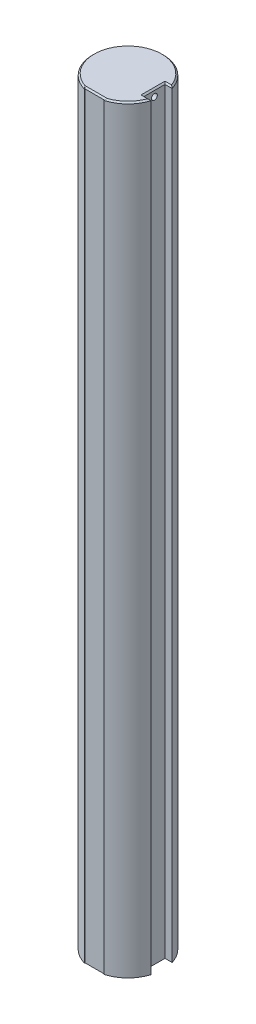
ISO-10303-21;
HEADER;
FILE_DESCRIPTION(('STEP AP214'),'2;1');
FILE_NAME('part.step','',(''),(''),'','','');
FILE_SCHEMA(('AUTOMOTIVE_DESIGN { 1 0 10303 214 1 1 1 1 }'));
ENDSEC;
DATA;
#1=APPLICATION_CONTEXT('core data for automotive mechanical design processes');
#2=APPLICATION_PROTOCOL_DEFINITION('international standard','automotive_design',2000,#1);
#3=PRODUCT_CONTEXT('',#1,'mechanical');
#4=PRODUCT('Part','Part','',(#3));
#5=PRODUCT_RELATED_PRODUCT_CATEGORY('part','',(#4));
#6=PRODUCT_DEFINITION_FORMATION('','',#4);
#7=PRODUCT_DEFINITION_CONTEXT('part definition',#1,'design');
#8=PRODUCT_DEFINITION('design','',#6,#7);
#9=PRODUCT_DEFINITION_SHAPE('','',#8);
#10=(LENGTH_UNIT() NAMED_UNIT(*) SI_UNIT(.MILLI.,.METRE.));
#11=(NAMED_UNIT(*) PLANE_ANGLE_UNIT() SI_UNIT($,.RADIAN.));
#12=(NAMED_UNIT(*) SI_UNIT($,.STERADIAN.) SOLID_ANGLE_UNIT());
#13=UNCERTAINTY_MEASURE_WITH_UNIT(LENGTH_MEASURE(1.E-05),#10,'distance_accuracy_value','');
#14=(GEOMETRIC_REPRESENTATION_CONTEXT(3) GLOBAL_UNCERTAINTY_ASSIGNED_CONTEXT((#13)) GLOBAL_UNIT_ASSIGNED_CONTEXT((#10,
#11,#12)) REPRESENTATION_CONTEXT('',''));
#15=CARTESIAN_POINT('',(0.,0.,0.));
#16=DIRECTION('',(0.,0.,1.));
#17=DIRECTION('',(1.,0.,0.));
#18=AXIS2_PLACEMENT_3D('',#15,#16,#17);
#19=CARTESIAN_POINT('',(0.,430.4,0.));
#20=DIRECTION('',(0.,-1.,0.));
#21=DIRECTION('',(0.,0.,-1.));
#22=AXIS2_PLACEMENT_3D('',#19,#20,#21);
#23=CYLINDRICAL_SURFACE('',#22,20.);
#24=DIRECTION('',(0.,-1.,0.));
#25=VECTOR('',#24,1.);
#26=CARTESIAN_POINT('',(19.0787840283389,430.401,6.00000000000001));
#27=LINE('',#26,#25);
#28=CARTESIAN_POINT('',(19.0787840283389,429.6,6.00000000000001));
#29=VERTEX_POINT('',#28);
#30=CARTESIAN_POINT('',(19.0787840283389,0.,6.00000000000001));
#31=VERTEX_POINT('',#30);
#32=EDGE_CURVE('E149',#29,#31,#27,.T.);
#33=ORIENTED_EDGE('',*,*,#32,.F.);
#34=CARTESIAN_POINT('',(0.,429.6,0.));
#35=DIRECTION('',(0.,1.,0.));
#36=DIRECTION('',(0.,0.,1.));
#37=AXIS2_PLACEMENT_3D('',#34,#35,#36);
#38=CIRCLE('',#37,20.);
#39=CARTESIAN_POINT('',(5.5,429.6,19.2288845230294));
#40=VERTEX_POINT('',#39);
#41=EDGE_CURVE('E11',#29,#40,#38,.F.);
#42=ORIENTED_EDGE('',*,*,#41,.T.);
#43=DIRECTION('',(0.,-1.,0.));
#44=VECTOR('',#43,1.);
#45=CARTESIAN_POINT('',(5.5,430.401,19.2288845230294));
#46=LINE('',#45,#44);
#47=CARTESIAN_POINT('',(5.5,0.,19.2288845230294));
#48=VERTEX_POINT('',#47);
#49=EDGE_CURVE('E314',#40,#48,#46,.T.);
#50=ORIENTED_EDGE('',*,*,#49,.T.);
#51=CARTESIAN_POINT('',(0.,0.,0.));
#52=DIRECTION('',(0.,1.,0.));
#53=DIRECTION('',(0.,0.,1.));
#54=AXIS2_PLACEMENT_3D('',#51,#52,#53);
#55=CIRCLE('',#54,20.);
#56=EDGE_CURVE('E359',#48,#31,#55,.T.);
#57=ORIENTED_EDGE('',*,*,#56,.T.);
#58=EDGE_LOOP('',(#33,#42,#50,#57));
#59=FACE_BOUND('',#58,.T.);
#60=ADVANCED_FACE('F36',(#59),#23,.T.);
#61=DIRECTION('',(0.,-1.,0.));
#62=VECTOR('',#61,1.);
#63=CARTESIAN_POINT('',(-5.5,430.401,19.2288845230294));
#64=LINE('',#63,#62);
#65=CARTESIAN_POINT('',(-5.5,429.6,19.2288845230294));
#66=VERTEX_POINT('',#65);
#67=CARTESIAN_POINT('',(-5.5,0.,19.2288845230294));
#68=VERTEX_POINT('',#67);
#69=EDGE_CURVE('E324',#66,#68,#64,.T.);
#70=ORIENTED_EDGE('',*,*,#69,.F.);
#71=CARTESIAN_POINT('',(0.,429.6,0.));
#72=DIRECTION('',(0.,1.,0.));
#73=DIRECTION('',(0.,0.,1.));
#74=AXIS2_PLACEMENT_3D('',#71,#72,#73);
#75=CIRCLE('',#74,20.);
#76=CARTESIAN_POINT('',(19.0787840283389,429.6,-5.99999999999999));
#77=VERTEX_POINT('',#76);
#78=EDGE_CURVE('E167',#66,#77,#75,.F.);
#79=ORIENTED_EDGE('',*,*,#78,.T.);
#80=DIRECTION('',(0.,-1.,0.));
#81=VECTOR('',#80,1.);
#82=CARTESIAN_POINT('',(19.0787840283389,430.401,-5.99999999999999));
#83=LINE('',#82,#81);
#84=CARTESIAN_POINT('',(19.0787840283389,0.,-5.99999999999999));
#85=VERTEX_POINT('',#84);
#86=EDGE_CURVE('E152',#77,#85,#83,.T.);
#87=ORIENTED_EDGE('',*,*,#86,.T.);
#88=EDGE_CURVE('E358',#85,#68,#55,.T.);
#89=ORIENTED_EDGE('',*,*,#88,.T.);
#90=EDGE_LOOP('',(#70,#79,#87,#89));
#91=FACE_BOUND('',#90,.T.);
#92=ADVANCED_FACE('F230',(#91),#23,.T.);
#93=CARTESIAN_POINT('',(0.,430.4,0.));
#94=DIRECTION('',(0.,1.,0.));
#95=DIRECTION('',(0.,0.,1.));
#96=AXIS2_PLACEMENT_3D('',#93,#94,#95);
#97=PLANE('',#96);
#98=DIRECTION('',(1.,0.,0.));
#99=VECTOR('',#98,1.);
#100=CARTESIAN_POINT('',(0.,430.4,18.1000000000002));
#101=LINE('',#100,#99);
#102=CARTESIAN_POINT('',(-6.29999999999975,430.4,18.1000000000002));
#103=VERTEX_POINT('',#102);
#104=CARTESIAN_POINT('',(6.29999999999975,430.4,18.1000000000002));
#105=VERTEX_POINT('',#104);
#106=EDGE_CURVE('E334',#103,#105,#101,.T.);
#107=ORIENTED_EDGE('',*,*,#106,.T.);
#108=DIRECTION('',(0.,0.,1.));
#109=VECTOR('',#108,1.);
#110=CARTESIAN_POINT('',(6.29999999999975,430.4,0.));
#111=LINE('',#110,#109);
#112=CARTESIAN_POINT('',(6.29999999999975,430.4,18.1369788002306));
#113=VERTEX_POINT('',#112);
#114=EDGE_CURVE('E330',#105,#113,#111,.T.);
#115=ORIENTED_EDGE('',*,*,#114,.T.);
#116=CARTESIAN_POINT('',(0.,430.4,0.));
#117=DIRECTION('',(0.,1.,0.));
#118=DIRECTION('',(0.,0.,1.));
#119=AXIS2_PLACEMENT_3D('',#116,#117,#118);
#120=CIRCLE('',#119,19.2000000000002);
#121=CARTESIAN_POINT('',(17.9555005499711,430.4,6.79999999999974));
#122=VERTEX_POINT('',#121);
#123=EDGE_CURVE('E379',#113,#122,#120,.T.);
#124=ORIENTED_EDGE('',*,*,#123,.T.);
#125=DIRECTION('',(-1.,0.,0.));
#126=VECTOR('',#125,1.);
#127=CARTESIAN_POINT('',(0.,430.4,6.79999999999976));
#128=LINE('',#127,#126);
#129=CARTESIAN_POINT('',(14.2000000000002,430.4,6.79999999999976));
#130=VERTEX_POINT('',#129);
#131=EDGE_CURVE('E308',#122,#130,#128,.T.);
#132=ORIENTED_EDGE('',*,*,#131,.T.);
#133=DIRECTION('',(0.,0.,-1.));
#134=VECTOR('',#133,1.);
#135=CARTESIAN_POINT('',(14.2000000000002,430.4,0.));
#136=LINE('',#135,#134);
#137=CARTESIAN_POINT('',(14.2000000000002,430.4,-6.79999999999975));
#138=VERTEX_POINT('',#137);
#139=EDGE_CURVE('E304',#130,#138,#136,.T.);
#140=ORIENTED_EDGE('',*,*,#139,.T.);
#141=DIRECTION('',(1.,0.,0.));
#142=VECTOR('',#141,1.);
#143=CARTESIAN_POINT('',(0.,430.4,-6.79999999999975));
#144=LINE('',#143,#142);
#145=CARTESIAN_POINT('',(17.9555005499711,430.4,-6.79999999999975));
#146=VERTEX_POINT('',#145);
#147=EDGE_CURVE('E301',#138,#146,#144,.T.);
#148=ORIENTED_EDGE('',*,*,#147,.T.);
#149=CARTESIAN_POINT('',(0.,430.4,0.));
#150=DIRECTION('',(0.,1.,0.));
#151=DIRECTION('',(0.,0.,1.));
#152=AXIS2_PLACEMENT_3D('',#149,#150,#151);
#153=CIRCLE('',#152,19.2000000000002);
#154=CARTESIAN_POINT('',(-6.29999999999975,430.4,18.1369788002306));
#155=VERTEX_POINT('',#154);
#156=EDGE_CURVE('E386',#146,#155,#153,.T.);
#157=ORIENTED_EDGE('',*,*,#156,.T.);
#158=DIRECTION('',(0.,0.,-1.));
#159=VECTOR('',#158,1.);
#160=CARTESIAN_POINT('',(-6.29999999999975,430.4,0.));
#161=LINE('',#160,#159);
#162=EDGE_CURVE('E388',#155,#103,#161,.T.);
#163=ORIENTED_EDGE('',*,*,#162,.T.);
#164=EDGE_LOOP('',(#107,#115,#124,#132,#140,#148,#157,#163));
#165=FACE_BOUND('',#164,.T.);
#166=ADVANCED_FACE('F235',(#165),#97,.T.);
#167=CARTESIAN_POINT('',(0.,0.,0.));
#168=DIRECTION('',(0.,1.,0.));
#169=DIRECTION('',(0.,0.,1.));
#170=AXIS2_PLACEMENT_3D('',#167,#168,#169);
#171=PLANE('',#170);
#172=CARTESIAN_POINT('',(0.,0.,12.5));
#173=DIRECTION('',(0.,-1.,0.));
#174=DIRECTION('',(0.,0.,-1.));
#175=AXIS2_PLACEMENT_3D('',#172,#173,#174);
#176=CIRCLE('',#175,3.39999999999999);
#177=CARTESIAN_POINT('',(0.,0.,9.10000000000001));
#178=VERTEX_POINT('',#177);
#179=EDGE_CURVE('E346',#178,#178,#176,.T.);
#180=ORIENTED_EDGE('',*,*,#179,.F.);
#181=EDGE_LOOP('',(#180));
#182=FACE_BOUND('',#181,.T.);
#183=CARTESIAN_POINT('',(0.,0.,-12.5));
#184=DIRECTION('',(0.,-1.,0.));
#185=DIRECTION('',(0.,0.,-1.));
#186=AXIS2_PLACEMENT_3D('',#183,#184,#185);
#187=CIRCLE('',#186,3.39999999999999);
#188=CARTESIAN_POINT('',(0.,0.,-15.9));
#189=VERTEX_POINT('',#188);
#190=EDGE_CURVE('E352',#189,#189,#187,.T.);
#191=ORIENTED_EDGE('',*,*,#190,.F.);
#192=EDGE_LOOP('',(#191));
#193=FACE_BOUND('',#192,.T.);
#194=DIRECTION('',(-1.,0.,0.));
#195=VECTOR('',#194,1.);
#196=CARTESIAN_POINT('',(0.,0.,6.00000000000001));
#197=LINE('',#196,#195);
#198=CARTESIAN_POINT('',(15.,0.,6.00000000000001));
#199=VERTEX_POINT('',#198);
#200=EDGE_CURVE('E377',#31,#199,#197,.T.);
#201=ORIENTED_EDGE('',*,*,#200,.F.);
#202=ORIENTED_EDGE('',*,*,#56,.F.);
#203=DIRECTION('',(0.,0.,1.));
#204=VECTOR('',#203,1.);
#205=CARTESIAN_POINT('',(5.5,0.,0.));
#206=LINE('',#205,#204);
#207=CARTESIAN_POINT('',(5.5,0.,18.9));
#208=VERTEX_POINT('',#207);
#209=EDGE_CURVE('E321',#208,#48,#206,.T.);
#210=ORIENTED_EDGE('',*,*,#209,.F.);
#211=DIRECTION('',(1.,0.,0.));
#212=VECTOR('',#211,1.);
#213=CARTESIAN_POINT('',(0.,0.,18.9));
#214=LINE('',#213,#212);
#215=CARTESIAN_POINT('',(-5.5,0.,18.9));
#216=VERTEX_POINT('',#215);
#217=EDGE_CURVE('E407',#216,#208,#214,.T.);
#218=ORIENTED_EDGE('',*,*,#217,.F.);
#219=DIRECTION('',(0.,0.,-1.));
#220=VECTOR('',#219,1.);
#221=CARTESIAN_POINT('',(-5.5,0.,0.));
#222=LINE('',#221,#220);
#223=EDGE_CURVE('E373',#68,#216,#222,.T.);
#224=ORIENTED_EDGE('',*,*,#223,.F.);
#225=ORIENTED_EDGE('',*,*,#88,.F.);
#226=DIRECTION('',(1.,0.,0.));
#227=VECTOR('',#226,1.);
#228=CARTESIAN_POINT('',(0.,0.,-5.99999999999999));
#229=LINE('',#228,#227);
#230=CARTESIAN_POINT('',(15.,0.,-5.99999999999999));
#231=VERTEX_POINT('',#230);
#232=EDGE_CURVE('E371',#231,#85,#229,.T.);
#233=ORIENTED_EDGE('',*,*,#232,.F.);
#234=DIRECTION('',(0.,0.,-1.));
#235=VECTOR('',#234,1.);
#236=CARTESIAN_POINT('',(15.,0.,0.));
#237=LINE('',#236,#235);
#238=EDGE_CURVE('E293',#199,#231,#237,.T.);
#239=ORIENTED_EDGE('',*,*,#238,.F.);
#240=EDGE_LOOP('',(#201,#202,#210,#218,#224,#225,#233,#239));
#241=FACE_BOUND('',#240,.T.);
#242=ADVANCED_FACE('F238',(#182,#193,#241),#171,.F.);
#243=CARTESIAN_POINT('',(0.,22.25,-12.5));
#244=DIRECTION('',(0.,-1.,0.));
#245=DIRECTION('',(0.,0.,-1.));
#246=AXIS2_PLACEMENT_3D('',#243,#244,#245);
#247=CONICAL_SURFACE('',#246,3.4,1.02974425867665);
#248=CARTESIAN_POINT('',(0.,24.2929261046937,-12.5));
#249=VERTEX_POINT('',#248);
#250=VERTEX_LOOP('',#249);
#251=FACE_BOUND('',#250,.T.);
#252=CARTESIAN_POINT('',(0.,22.25,-12.5));
#253=DIRECTION('',(0.,-1.,0.));
#254=DIRECTION('',(0.,0.,-1.));
#255=AXIS2_PLACEMENT_3D('',#252,#253,#254);
#256=CIRCLE('',#255,3.4);
#257=CARTESIAN_POINT('',(0.,22.25,-15.9));
#258=VERTEX_POINT('',#257);
#259=EDGE_CURVE('E355',#258,#258,#256,.T.);
#260=ORIENTED_EDGE('',*,*,#259,.T.);
#261=EDGE_LOOP('',(#260));
#262=FACE_BOUND('',#261,.T.);
#263=ADVANCED_FACE('F241',(#251,#262),#247,.F.);
#264=CARTESIAN_POINT('',(0.,0.,-12.5));
#265=DIRECTION('',(0.,-1.,0.));
#266=DIRECTION('',(0.,0.,-1.));
#267=AXIS2_PLACEMENT_3D('',#264,#265,#266);
#268=CYLINDRICAL_SURFACE('',#267,3.39999999999999);
#269=ORIENTED_EDGE('',*,*,#259,.F.);
#270=EDGE_LOOP('',(#269));
#271=FACE_BOUND('',#270,.T.);
#272=ORIENTED_EDGE('',*,*,#190,.T.);
#273=EDGE_LOOP('',(#272));
#274=FACE_BOUND('',#273,.T.);
#275=ADVANCED_FACE('F248',(#271,#274),#268,.F.);
#276=CARTESIAN_POINT('',(0.,22.25,12.5));
#277=DIRECTION('',(0.,-1.,0.));
#278=DIRECTION('',(0.,0.,-1.));
#279=AXIS2_PLACEMENT_3D('',#276,#277,#278);
#280=CONICAL_SURFACE('',#279,3.4,1.02974425867665);
#281=CARTESIAN_POINT('',(0.,24.2929261046937,12.5));
#282=VERTEX_POINT('',#281);
#283=VERTEX_LOOP('',#282);
#284=FACE_BOUND('',#283,.T.);
#285=CARTESIAN_POINT('',(0.,22.25,12.5));
#286=DIRECTION('',(0.,-1.,0.));
#287=DIRECTION('',(0.,0.,-1.));
#288=AXIS2_PLACEMENT_3D('',#285,#286,#287);
#289=CIRCLE('',#288,3.4);
#290=CARTESIAN_POINT('',(0.,22.25,9.1));
#291=VERTEX_POINT('',#290);
#292=EDGE_CURVE('E349',#291,#291,#289,.T.);
#293=ORIENTED_EDGE('',*,*,#292,.T.);
#294=EDGE_LOOP('',(#293));
#295=FACE_BOUND('',#294,.T.);
#296=ADVANCED_FACE('F252',(#284,#295),#280,.F.);
#297=CARTESIAN_POINT('',(0.,0.,12.5));
#298=DIRECTION('',(0.,-1.,0.));
#299=DIRECTION('',(0.,0.,-1.));
#300=AXIS2_PLACEMENT_3D('',#297,#298,#299);
#301=CYLINDRICAL_SURFACE('',#300,3.39999999999999);
#302=ORIENTED_EDGE('',*,*,#292,.F.);
#303=EDGE_LOOP('',(#302));
#304=FACE_BOUND('',#303,.T.);
#305=ORIENTED_EDGE('',*,*,#179,.T.);
#306=EDGE_LOOP('',(#305));
#307=FACE_BOUND('',#306,.T.);
#308=ADVANCED_FACE('F256',(#304,#307),#301,.F.);
#309=CARTESIAN_POINT('',(-5.5,-1.2E-05,19.2288845230294));
#310=DIRECTION('',(1.,0.,0.));
#311=DIRECTION('',(0.,0.,-1.));
#312=AXIS2_PLACEMENT_3D('',#309,#310,#311);
#313=PLANE('',#312);
#314=DIRECTION('',(0.,1.,0.));
#315=VECTOR('',#314,1.);
#316=CARTESIAN_POINT('',(-5.5,-1.2E-05,18.9));
#317=LINE('',#316,#315);
#318=CARTESIAN_POINT('',(-5.5,429.6,18.9));
#319=VERTEX_POINT('',#318);
#320=EDGE_CURVE('E343',#216,#319,#317,.T.);
#321=ORIENTED_EDGE('',*,*,#320,.T.);
#322=DIRECTION('',(0.,0.,1.));
#323=VECTOR('',#322,1.);
#324=CARTESIAN_POINT('',(-5.5,429.6,19.2288845230294));
#325=LINE('',#324,#323);
#326=EDGE_CURVE('E165',#319,#66,#325,.T.);
#327=ORIENTED_EDGE('',*,*,#326,.T.);
#328=ORIENTED_EDGE('',*,*,#69,.T.);
#329=ORIENTED_EDGE('',*,*,#223,.T.);
#330=EDGE_LOOP('',(#321,#327,#328,#329));
#331=FACE_BOUND('',#330,.T.);
#332=ADVANCED_FACE('F260',(#331),#313,.T.);
#333=CARTESIAN_POINT('',(-5.5,-1.2E-05,18.9));
#334=DIRECTION('',(0.,0.,1.));
#335=DIRECTION('',(1.,0.,0.));
#336=AXIS2_PLACEMENT_3D('',#333,#334,#335);
#337=PLANE('',#336);
#338=DIRECTION('',(0.,1.,0.));
#339=VECTOR('',#338,1.);
#340=CARTESIAN_POINT('',(5.5,-1.2E-05,18.9));
#341=LINE('',#340,#339);
#342=CARTESIAN_POINT('',(5.5,429.6,18.9));
#343=VERTEX_POINT('',#342);
#344=EDGE_CURVE('E323',#208,#343,#341,.T.);
#345=ORIENTED_EDGE('',*,*,#344,.T.);
#346=DIRECTION('',(-1.,0.,0.));
#347=VECTOR('',#346,1.);
#348=CARTESIAN_POINT('',(-5.5,429.6,18.9));
#349=LINE('',#348,#347);
#350=EDGE_CURVE('E329',#343,#319,#349,.T.);
#351=ORIENTED_EDGE('',*,*,#350,.T.);
#352=ORIENTED_EDGE('',*,*,#320,.F.);
#353=ORIENTED_EDGE('',*,*,#217,.T.);
#354=EDGE_LOOP('',(#345,#351,#352,#353));
#355=FACE_BOUND('',#354,.T.);
#356=ADVANCED_FACE('F264',(#355),#337,.T.);
#357=CARTESIAN_POINT('',(5.5,-1.2E-05,18.9));
#358=DIRECTION('',(-1.,0.,0.));
#359=DIRECTION('',(0.,0.,1.));
#360=AXIS2_PLACEMENT_3D('',#357,#358,#359);
#361=PLANE('',#360);
#362=ORIENTED_EDGE('',*,*,#49,.F.);
#363=DIRECTION('',(0.,0.,-1.));
#364=VECTOR('',#363,1.);
#365=CARTESIAN_POINT('',(5.5,429.6,18.9));
#366=LINE('',#365,#364);
#367=EDGE_CURVE('E318',#40,#343,#366,.T.);
#368=ORIENTED_EDGE('',*,*,#367,.T.);
#369=ORIENTED_EDGE('',*,*,#344,.F.);
#370=ORIENTED_EDGE('',*,*,#209,.T.);
#371=EDGE_LOOP('',(#362,#368,#369,#370));
#372=FACE_BOUND('',#371,.T.);
#373=ADVANCED_FACE('F268',(#372),#361,.T.);
#374=CARTESIAN_POINT('',(19.0787840283389,-1.2E-05,6.00000000000001));
#375=DIRECTION('',(0.,0.,-1.));
#376=DIRECTION('',(-1.,0.,0.));
#377=AXIS2_PLACEMENT_3D('',#374,#375,#376);
#378=PLANE('',#377);
#379=DIRECTION('',(0.,1.,0.));
#380=VECTOR('',#379,1.);
#381=CARTESIAN_POINT('',(15.,-1.2E-05,6.00000000000001));
#382=LINE('',#381,#380);
#383=CARTESIAN_POINT('',(15.,429.6,6.00000000000001));
#384=VERTEX_POINT('',#383);
#385=EDGE_CURVE('E296',#199,#384,#382,.T.);
#386=ORIENTED_EDGE('',*,*,#385,.T.);
#387=DIRECTION('',(1.,0.,0.));
#388=VECTOR('',#387,1.);
#389=CARTESIAN_POINT('',(19.0787840283389,429.6,6.00000000000001));
#390=LINE('',#389,#388);
#391=EDGE_CURVE('E50',#384,#29,#390,.T.);
#392=ORIENTED_EDGE('',*,*,#391,.T.);
#393=ORIENTED_EDGE('',*,*,#32,.T.);
#394=ORIENTED_EDGE('',*,*,#200,.T.);
#395=EDGE_LOOP('',(#386,#392,#393,#394));
#396=FACE_BOUND('',#395,.T.);
#397=ADVANCED_FACE('F272',(#396),#378,.T.);
#398=CARTESIAN_POINT('',(15.,-1.2E-05,6.00000000000001));
#399=DIRECTION('',(1.,0.,0.));
#400=DIRECTION('',(0.,0.,-1.));
#401=AXIS2_PLACEMENT_3D('',#398,#399,#400);
#402=PLANE('',#401);
#403=CARTESIAN_POINT('',(15.,426.4,0.));
#404=DIRECTION('',(1.,0.,0.));
#405=DIRECTION('',(0.,0.,-1.));
#406=AXIS2_PLACEMENT_3D('',#403,#404,#405);
#407=CIRCLE('',#406,1.64999999999998);
#408=CARTESIAN_POINT('',(15.,426.4,-1.64999999999999));
#409=VERTEX_POINT('',#408);
#410=EDGE_CURVE('E150',#409,#409,#407,.T.);
#411=ORIENTED_EDGE('',*,*,#410,.F.);
#412=EDGE_LOOP('',(#411));
#413=FACE_BOUND('',#412,.T.);
#414=DIRECTION('',(0.,1.,0.));
#415=VECTOR('',#414,1.);
#416=CARTESIAN_POINT('',(15.,-1.2E-05,-5.99999999999999));
#417=LINE('',#416,#415);
#418=CARTESIAN_POINT('',(15.,429.6,-5.99999999999999));
#419=VERTEX_POINT('',#418);
#420=EDGE_CURVE('E164',#231,#419,#417,.T.);
#421=ORIENTED_EDGE('',*,*,#420,.T.);
#422=DIRECTION('',(0.,0.,1.));
#423=VECTOR('',#422,1.);
#424=CARTESIAN_POINT('',(15.,429.6,6.00000000000001));
#425=LINE('',#424,#423);
#426=EDGE_CURVE('E65',#419,#384,#425,.T.);
#427=ORIENTED_EDGE('',*,*,#426,.T.);
#428=ORIENTED_EDGE('',*,*,#385,.F.);
#429=ORIENTED_EDGE('',*,*,#238,.T.);
#430=EDGE_LOOP('',(#421,#427,#428,#429));
#431=FACE_BOUND('',#430,.T.);
#432=ADVANCED_FACE('F276',(#413,#431),#402,.T.);
#433=CARTESIAN_POINT('',(15.,-1.2E-05,-5.99999999999999));
#434=DIRECTION('',(0.,0.,1.));
#435=DIRECTION('',(1.,0.,0.));
#436=AXIS2_PLACEMENT_3D('',#433,#434,#435);
#437=PLANE('',#436);
#438=ORIENTED_EDGE('',*,*,#86,.F.);
#439=DIRECTION('',(-1.,0.,0.));
#440=VECTOR('',#439,1.);
#441=CARTESIAN_POINT('',(15.,429.6,-5.99999999999999));
#442=LINE('',#441,#440);
#443=EDGE_CURVE('E169',#77,#419,#442,.T.);
#444=ORIENTED_EDGE('',*,*,#443,.T.);
#445=ORIENTED_EDGE('',*,*,#420,.F.);
#446=ORIENTED_EDGE('',*,*,#232,.T.);
#447=EDGE_LOOP('',(#438,#444,#445,#446));
#448=FACE_BOUND('',#447,.T.);
#449=ADVANCED_FACE('F143',(#448),#437,.T.);
#450=CARTESIAN_POINT('',(3.5,426.4,0.));
#451=DIRECTION('',(1.,0.,0.));
#452=DIRECTION('',(0.,0.,-1.));
#453=AXIS2_PLACEMENT_3D('',#450,#451,#452);
#454=CONICAL_SURFACE('',#453,1.64999999999998,1.02974425867665);
#455=CARTESIAN_POINT('',(2.50857997860452,426.4,0.));
#456=VERTEX_POINT('',#455);
#457=VERTEX_LOOP('',#456);
#458=FACE_BOUND('',#457,.T.);
#459=CARTESIAN_POINT('',(3.5,426.4,0.));
#460=DIRECTION('',(1.,0.,0.));
#461=DIRECTION('',(0.,0.,-1.));
#462=AXIS2_PLACEMENT_3D('',#459,#460,#461);
#463=CIRCLE('',#462,1.64999999999998);
#464=CARTESIAN_POINT('',(3.5,426.4,-1.64999999999999));
#465=VERTEX_POINT('',#464);
#466=EDGE_CURVE('E147',#465,#465,#463,.T.);
#467=ORIENTED_EDGE('',*,*,#466,.T.);
#468=EDGE_LOOP('',(#467));
#469=FACE_BOUND('',#468,.T.);
#470=ADVANCED_FACE('F139',(#458,#469),#454,.F.);
#471=CARTESIAN_POINT('',(15.,426.4,0.));
#472=DIRECTION('',(1.,0.,0.));
#473=DIRECTION('',(0.,0.,-1.));
#474=AXIS2_PLACEMENT_3D('',#471,#472,#473);
#475=CYLINDRICAL_SURFACE('',#474,1.64999999999998);
#476=ORIENTED_EDGE('',*,*,#466,.F.);
#477=EDGE_LOOP('',(#476));
#478=FACE_BOUND('',#477,.T.);
#479=ORIENTED_EDGE('',*,*,#410,.T.);
#480=EDGE_LOOP('',(#479));
#481=FACE_BOUND('',#480,.T.);
#482=ADVANCED_FACE('F142',(#478,#481),#475,.F.);
#483=CARTESIAN_POINT('',(0.,430.4,-6.79999999999975));
#484=DIRECTION('',(0.,-0.707106781186527,-0.707106781186568));
#485=DIRECTION('',(1.,0.,0.));
#486=AXIS2_PLACEMENT_3D('',#483,#484,#485);
#487=PLANE('',#486);
#488=DIRECTION('',(-0.577350269189615,0.577350269189648,-0.577350269189615));
#489=VECTOR('',#488,1.);
#490=CARTESIAN_POINT('',(9.46666666666701,435.133333333334,-11.533333333333));
#491=LINE('',#490,#489);
#492=EDGE_CURVE('E215',#419,#138,#491,.T.);
#493=ORIENTED_EDGE('',*,*,#492,.F.);
#494=ORIENTED_EDGE('',*,*,#443,.F.);
#495=CARTESIAN_POINT('',(19.0787840283389,429.6,-6.));
#496=CARTESIAN_POINT('',(18.9865895774987,429.667652125201,-6.06765212520062));
#497=CARTESIAN_POINT('',(18.894048649003,429.735068333774,-6.13506833377358));
#498=CARTESIAN_POINT('',(18.7082682497701,429.86941016473,-6.26941016473024));
#499=CARTESIAN_POINT('',(18.6150288194959,429.936335815094,-6.3363358150935));
#500=CARTESIAN_POINT('',(18.4278349509979,430.069685758759,-6.46968575875882));
#501=CARTESIAN_POINT('',(18.333880510626,430.136110050554,-6.53611005055337));
#502=CARTESIAN_POINT('',(18.1452404146605,430.268445108278,-6.66844510827792));
#503=CARTESIAN_POINT('',(18.0505547173393,430.334355844466,-6.73435584446529));
#504=CARTESIAN_POINT('',(17.9555005499711,430.4,-6.79999999999975));
#505=B_SPLINE_CURVE_WITH_KNOTS('',3,(#495,#496,#497,#498,#499,#500,#501,#502,#503,#504),
.UNSPECIFIED.,.F.,.F.,(4,2,2,2,4),(0.,0.398598086370078,0.7971732585231,1.19574962865172,
1.59434891331217),.UNSPECIFIED.);
#506=EDGE_CURVE('E41',#146,#77,#505,.F.);
#507=ORIENTED_EDGE('',*,*,#506,.F.);
#508=ORIENTED_EDGE('',*,*,#147,.F.);
#509=EDGE_LOOP('',(#493,#494,#507,#508));
#510=FACE_BOUND('',#509,.T.);
#511=ADVANCED_FACE('F38',(#510),#487,.F.);
#512=CARTESIAN_POINT('',(0.,430.4,0.));
#513=DIRECTION('',(0.,-1.,0.));
#514=DIRECTION('',(0.,0.,-1.));
#515=AXIS2_PLACEMENT_3D('',#512,#513,#514);
#516=CONICAL_SURFACE('',#515,19.2000000000002,0.785398163397418);
#517=ORIENTED_EDGE('',*,*,#506,.T.);
#518=ORIENTED_EDGE('',*,*,#78,.F.);
#519=CARTESIAN_POINT('',(-5.5,429.6,19.2288845230294));
#520=CARTESIAN_POINT('',(-5.56758917927919,429.667589179279,19.1392523514336));
#521=CARTESIAN_POINT('',(-5.63495741691077,429.734957416911,19.0492867404761));
#522=CARTESIAN_POINT('',(-5.76923462533641,429.869234625337,18.8686827685963));
#523=CARTESIAN_POINT('',(-5.83614362041637,429.936143620417,18.7780444437847));
#524=CARTESIAN_POINT('',(-5.96949235305694,430.069492353057,18.5960793680951));
#525=CARTESIAN_POINT('',(-6.03593208931216,430.135932089312,18.5047526153034));
#526=CARTESIAN_POINT('',(-6.16833102427168,430.268331024272,18.3213951932115));
#527=CARTESIAN_POINT('',(-6.23429019717467,430.334290197175,18.229364486652));
#528=CARTESIAN_POINT('',(-6.29999999999974,430.4,18.1369788002306));
#529=B_SPLINE_CURVE_WITH_KNOTS('',3,(#519,#520,#521,#522,#523,#524,#525,#526,#527,#528),
.UNSPECIFIED.,.F.,.F.,(4,2,2,2,4),(0.,0.393108425105751,0.786195898956159,1.17928446586928,
1.57239398431486),.UNSPECIFIED.);
#530=EDGE_CURVE('E209',#155,#66,#529,.F.);
#531=ORIENTED_EDGE('',*,*,#530,.F.);
#532=ORIENTED_EDGE('',*,*,#156,.F.);
#533=EDGE_LOOP('',(#517,#518,#531,#532));
#534=FACE_BOUND('',#533,.T.);
#535=ADVANCED_FACE('F216',(#534),#516,.T.);
#536=CARTESIAN_POINT('',(14.2000000000002,430.4,0.));
#537=DIRECTION('',(-0.707106781186568,-0.707106781186527,0.));
#538=DIRECTION('',(0.,0.,-1.));
#539=AXIS2_PLACEMENT_3D('',#536,#537,#538);
#540=PLANE('',#539);
#541=ORIENTED_EDGE('',*,*,#492,.T.);
#542=ORIENTED_EDGE('',*,*,#139,.F.);
#543=DIRECTION('',(-0.577350269189615,0.577350269189648,0.577350269189615));
#544=VECTOR('',#543,1.);
#545=CARTESIAN_POINT('',(16.4666666666667,428.133333333333,4.53333333333326));
#546=LINE('',#545,#544);
#547=EDGE_CURVE('E206',#384,#130,#546,.T.);
#548=ORIENTED_EDGE('',*,*,#547,.F.);
#549=ORIENTED_EDGE('',*,*,#426,.F.);
#550=EDGE_LOOP('',(#541,#542,#548,#549));
#551=FACE_BOUND('',#550,.T.);
#552=ADVANCED_FACE('F220',(#551),#540,.F.);
#553=CARTESIAN_POINT('',(-6.29999999999975,430.4,0.));
#554=DIRECTION('',(-0.707106781186568,-0.707106781186527,0.));
#555=DIRECTION('',(0.,0.,-1.));
#556=AXIS2_PLACEMENT_3D('',#553,#554,#555);
#557=PLANE('',#556);
#558=ORIENTED_EDGE('',*,*,#530,.T.);
#559=ORIENTED_EDGE('',*,*,#326,.F.);
#560=DIRECTION('',(-0.577350269189615,0.577350269189649,-0.577350269189614));
#561=VECTOR('',#560,1.);
#562=CARTESIAN_POINT('',(-4.19999999999991,428.3,20.2000000000001));
#563=LINE('',#562,#561);
#564=EDGE_CURVE('E203',#103,#319,#563,.F.);
#565=ORIENTED_EDGE('',*,*,#564,.F.);
#566=ORIENTED_EDGE('',*,*,#162,.F.);
#567=EDGE_LOOP('',(#558,#559,#565,#566));
#568=FACE_BOUND('',#567,.T.);
#569=ADVANCED_FACE('F195',(#568),#557,.F.);
#570=CARTESIAN_POINT('',(0.,430.4,6.79999999999976));
#571=DIRECTION('',(0.,-0.707106781186527,0.707106781186568));
#572=DIRECTION('',(-1.,0.,0.));
#573=AXIS2_PLACEMENT_3D('',#570,#571,#572);
#574=PLANE('',#573);
#575=ORIENTED_EDGE('',*,*,#547,.T.);
#576=ORIENTED_EDGE('',*,*,#131,.F.);
#577=CARTESIAN_POINT('',(19.0787840283389,429.6,6.00000000000001));
#578=CARTESIAN_POINT('',(18.9865895774987,429.667652125201,6.06765212520063));
#579=CARTESIAN_POINT('',(18.894048649003,429.735068333774,6.13506833377359));
#580=CARTESIAN_POINT('',(18.7082682497701,429.86941016473,6.26941016473025));
#581=CARTESIAN_POINT('',(18.6150288194959,429.936335815094,6.3363358150935));
#582=CARTESIAN_POINT('',(18.4278349509979,430.069685758759,6.46968575875882));
#583=CARTESIAN_POINT('',(18.333880510626,430.136110050554,6.53611005055337));
#584=CARTESIAN_POINT('',(18.1452404146605,430.268445108278,6.66844510827792));
#585=CARTESIAN_POINT('',(18.0505547173393,430.334355844466,6.73435584446529));
#586=CARTESIAN_POINT('',(17.9555005499711,430.4,6.79999999999974));
#587=B_SPLINE_CURVE_WITH_KNOTS('',3,(#577,#578,#579,#580,#581,#582,#583,#584,#585,#586),
.UNSPECIFIED.,.F.,.F.,(4,2,2,2,4),(0.,0.398598086370075,0.797173258523092,1.19574962865168,
1.59434891331214),.UNSPECIFIED.);
#588=EDGE_CURVE('E197',#29,#122,#587,.T.);
#589=ORIENTED_EDGE('',*,*,#588,.F.);
#590=ORIENTED_EDGE('',*,*,#391,.F.);
#591=EDGE_LOOP('',(#575,#576,#589,#590));
#592=FACE_BOUND('',#591,.T.);
#593=ADVANCED_FACE('F190',(#592),#574,.F.);
#594=CARTESIAN_POINT('',(0.,430.4,18.1000000000002));
#595=DIRECTION('',(0.,-0.707106781186526,-0.707106781186569));
#596=DIRECTION('',(1.,0.,0.));
#597=AXIS2_PLACEMENT_3D('',#594,#595,#596);
#598=PLANE('',#597);
#599=ORIENTED_EDGE('',*,*,#564,.T.);
#600=ORIENTED_EDGE('',*,*,#350,.F.);
#601=DIRECTION('',(0.577350269189615,0.577350269189649,-0.577350269189614));
#602=VECTOR('',#601,1.);
#603=CARTESIAN_POINT('',(12.3333333333329,436.433333333334,12.0666666666671));
#604=LINE('',#603,#602);
#605=EDGE_CURVE('E180',#105,#343,#604,.F.);
#606=ORIENTED_EDGE('',*,*,#605,.F.);
#607=ORIENTED_EDGE('',*,*,#106,.F.);
#608=EDGE_LOOP('',(#599,#600,#606,#607));
#609=FACE_BOUND('',#608,.T.);
#610=ADVANCED_FACE('F194',(#609),#598,.F.);
#611=CARTESIAN_POINT('',(0.,430.4,0.));
#612=DIRECTION('',(0.,-1.,0.));
#613=DIRECTION('',(0.,0.,-1.));
#614=AXIS2_PLACEMENT_3D('',#611,#612,#613);
#615=CONICAL_SURFACE('',#614,19.2000000000002,0.785398163397418);
#616=ORIENTED_EDGE('',*,*,#588,.T.);
#617=ORIENTED_EDGE('',*,*,#123,.F.);
#618=CARTESIAN_POINT('',(6.29999999999975,430.4,18.1369788002306));
#619=CARTESIAN_POINT('',(6.23429019717468,430.334290197175,18.229364486652));
#620=CARTESIAN_POINT('',(6.16833102427169,430.268331024272,18.3213951932114));
#621=CARTESIAN_POINT('',(6.03593208931217,430.135932089312,18.5047526153034));
#622=CARTESIAN_POINT('',(5.96949235305694,430.069492353057,18.5960793680951));
#623=CARTESIAN_POINT('',(5.83614362041637,429.936143620417,18.7780444437847));
#624=CARTESIAN_POINT('',(5.76923462533641,429.869234625337,18.8686827685963));
#625=CARTESIAN_POINT('',(5.63495741691078,429.734957416911,19.0492867404761));
#626=CARTESIAN_POINT('',(5.5675891792792,429.667589179279,19.1392523514336));
#627=CARTESIAN_POINT('',(5.50000000000001,429.6,19.2288845230294));
#628=B_SPLINE_CURVE_WITH_KNOTS('',3,(#618,#619,#620,#621,#622,#623,#624,#625,#626,#627),
.UNSPECIFIED.,.F.,.F.,(4,2,2,2,4),(0.,0.393109518445563,0.786198085358702,1.17928555920911,
1.57239398431485),.UNSPECIFIED.);
#629=EDGE_CURVE('E173',#40,#113,#628,.F.);
#630=ORIENTED_EDGE('',*,*,#629,.F.);
#631=ORIENTED_EDGE('',*,*,#41,.F.);
#632=EDGE_LOOP('',(#616,#617,#630,#631));
#633=FACE_BOUND('',#632,.T.);
#634=ADVANCED_FACE('F182',(#633),#615,.T.);
#635=CARTESIAN_POINT('',(6.29999999999975,430.4,0.));
#636=DIRECTION('',(0.707106781186568,-0.707106781186527,0.));
#637=DIRECTION('',(0.,0.,1.));
#638=AXIS2_PLACEMENT_3D('',#635,#636,#637);
#639=PLANE('',#638);
#640=ORIENTED_EDGE('',*,*,#605,.T.);
#641=ORIENTED_EDGE('',*,*,#367,.F.);
#642=ORIENTED_EDGE('',*,*,#629,.T.);
#643=ORIENTED_EDGE('',*,*,#114,.F.);
#644=EDGE_LOOP('',(#640,#641,#642,#643));
#645=FACE_BOUND('',#644,.T.);
#646=ADVANCED_FACE('F185',(#645),#639,.F.);
#647=CLOSED_SHELL('',(#60,#92,#166,#242,#263,#275,#296,#308,#332,#356,#373,#397,#432,#449,#470,
#482,#511,#535,#552,#569,#593,#610,#634,#646));
#648=MANIFOLD_SOLID_BREP('B2',#647);
#649=ADVANCED_BREP_SHAPE_REPRESENTATION('',(#18,#648),#14);
#650=SHAPE_DEFINITION_REPRESENTATION(#9,#649);
ENDSEC;
END-ISO-10303-21;
